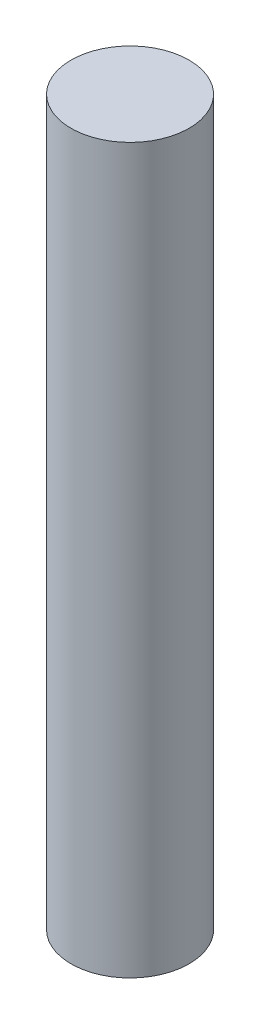
ISO-10303-21;
HEADER;
FILE_DESCRIPTION(('STEP AP214'),'2;1');
FILE_NAME('part.step','',(''),(''),'','','');
FILE_SCHEMA(('AUTOMOTIVE_DESIGN { 1 0 10303 214 1 1 1 1 }'));
ENDSEC;
DATA;
#1=APPLICATION_CONTEXT('core data for automotive mechanical design processes');
#2=APPLICATION_PROTOCOL_DEFINITION('international standard','automotive_design',2000,#1);
#3=PRODUCT_CONTEXT('',#1,'mechanical');
#4=PRODUCT('Part','Part','',(#3));
#5=PRODUCT_RELATED_PRODUCT_CATEGORY('part','',(#4));
#6=PRODUCT_DEFINITION_FORMATION('','',#4);
#7=PRODUCT_DEFINITION_CONTEXT('part definition',#1,'design');
#8=PRODUCT_DEFINITION('design','',#6,#7);
#9=PRODUCT_DEFINITION_SHAPE('','',#8);
#10=(LENGTH_UNIT() NAMED_UNIT(*) SI_UNIT(.MILLI.,.METRE.));
#11=(NAMED_UNIT(*) PLANE_ANGLE_UNIT() SI_UNIT($,.RADIAN.));
#12=(NAMED_UNIT(*) SI_UNIT($,.STERADIAN.) SOLID_ANGLE_UNIT());
#13=UNCERTAINTY_MEASURE_WITH_UNIT(LENGTH_MEASURE(1.E-05),#10,'distance_accuracy_value','');
#14=(GEOMETRIC_REPRESENTATION_CONTEXT(3) GLOBAL_UNCERTAINTY_ASSIGNED_CONTEXT((#13)) GLOBAL_UNIT_ASSIGNED_CONTEXT((#10,
#11,#12)) REPRESENTATION_CONTEXT('',''));
#15=CARTESIAN_POINT('',(0.,0.,0.));
#16=DIRECTION('',(0.,0.,1.));
#17=DIRECTION('',(1.,0.,0.));
#18=AXIS2_PLACEMENT_3D('',#15,#16,#17);
#19=CARTESIAN_POINT('',(-12.5,-4.9,7.5));
#20=DIRECTION('',(0.,-1.,0.));
#21=DIRECTION('',(0.,0.,-1.));
#22=AXIS2_PLACEMENT_3D('',#19,#20,#21);
#23=PLANE('',#22);
#24=CARTESIAN_POINT('',(-12.5,-4.9,7.5));
#25=DIRECTION('',(0.,-1.,0.));
#26=DIRECTION('',(0.,0.,-1.));
#27=AXIS2_PLACEMENT_3D('',#24,#25,#26);
#28=CIRCLE('',#27,0.399999999999973);
#29=CARTESIAN_POINT('',(-12.5,-4.9,7.10000000000003));
#30=VERTEX_POINT('',#29);
#31=EDGE_CURVE('E18',#30,#30,#28,.F.);
#32=ORIENTED_EDGE('',*,*,#31,.F.);
#33=EDGE_LOOP('',(#32));
#34=FACE_BOUND('',#33,.T.);
#35=ADVANCED_FACE('F15',(#34),#23,.T.);
#36=CARTESIAN_POINT('',(-12.5,0.,7.5));
#37=DIRECTION('',(0.,-1.,0.));
#38=DIRECTION('',(0.,0.,-1.));
#39=AXIS2_PLACEMENT_3D('',#36,#37,#38);
#40=PLANE('',#39);
#41=CARTESIAN_POINT('',(-12.5,0.,7.5));
#42=DIRECTION('',(0.,-1.,0.));
#43=DIRECTION('',(0.,0.,-1.));
#44=AXIS2_PLACEMENT_3D('',#41,#42,#43);
#45=CIRCLE('',#44,0.399999999999973);
#46=CARTESIAN_POINT('',(-12.5,0.,7.10000000000003));
#47=VERTEX_POINT('',#46);
#48=EDGE_CURVE('E10',#47,#47,#45,.T.);
#49=ORIENTED_EDGE('',*,*,#48,.F.);
#50=EDGE_LOOP('',(#49));
#51=FACE_BOUND('',#50,.T.);
#52=ADVANCED_FACE('F30',(#51),#40,.F.);
#53=CARTESIAN_POINT('',(-12.5,-4.9,7.5));
#54=DIRECTION('',(0.,-1.,0.));
#55=DIRECTION('',(0.,0.,-1.));
#56=AXIS2_PLACEMENT_3D('',#53,#54,#55);
#57=CYLINDRICAL_SURFACE('',#56,0.399999999999973);
#58=ORIENTED_EDGE('',*,*,#48,.T.);
#59=EDGE_LOOP('',(#58));
#60=FACE_BOUND('',#59,.T.);
#61=ORIENTED_EDGE('',*,*,#31,.T.);
#62=EDGE_LOOP('',(#61));
#63=FACE_BOUND('',#62,.T.);
#64=ADVANCED_FACE('F27',(#60,#63),#57,.T.);
#65=CLOSED_SHELL('',(#35,#52,#64));
#66=MANIFOLD_SOLID_BREP('B1',#65);
#67=ADVANCED_BREP_SHAPE_REPRESENTATION('',(#18,#66),#14);
#68=SHAPE_DEFINITION_REPRESENTATION(#9,#67);
ENDSEC;
END-ISO-10303-21;
